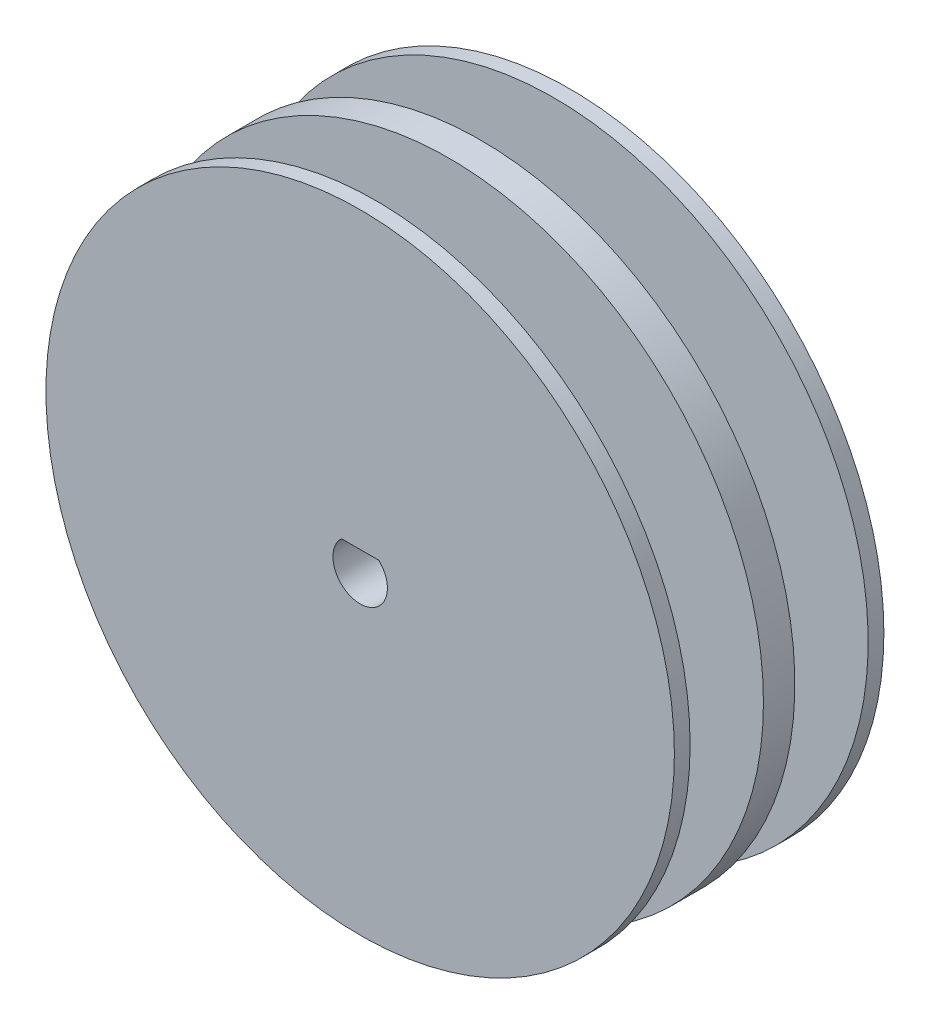
ISO-10303-21;
HEADER;
FILE_DESCRIPTION(('STEP AP214'),'2;1');
FILE_NAME('part.step','',(''),(''),'','','');
FILE_SCHEMA(('AUTOMOTIVE_DESIGN { 1 0 10303 214 1 1 1 1 }'));
ENDSEC;
DATA;
#1=APPLICATION_CONTEXT('core data for automotive mechanical design processes');
#2=APPLICATION_PROTOCOL_DEFINITION('international standard','automotive_design',2000,#1);
#3=PRODUCT_CONTEXT('',#1,'mechanical');
#4=PRODUCT('Part','Part','',(#3));
#5=PRODUCT_RELATED_PRODUCT_CATEGORY('part','',(#4));
#6=PRODUCT_DEFINITION_FORMATION('','',#4);
#7=PRODUCT_DEFINITION_CONTEXT('part definition',#1,'design');
#8=PRODUCT_DEFINITION('design','',#6,#7);
#9=PRODUCT_DEFINITION_SHAPE('','',#8);
#10=(LENGTH_UNIT() NAMED_UNIT(*) SI_UNIT(.MILLI.,.METRE.));
#11=(NAMED_UNIT(*) PLANE_ANGLE_UNIT() SI_UNIT($,.RADIAN.));
#12=(NAMED_UNIT(*) SI_UNIT($,.STERADIAN.) SOLID_ANGLE_UNIT());
#13=UNCERTAINTY_MEASURE_WITH_UNIT(LENGTH_MEASURE(1.E-05),#10,'distance_accuracy_value','');
#14=(GEOMETRIC_REPRESENTATION_CONTEXT(3) GLOBAL_UNCERTAINTY_ASSIGNED_CONTEXT((#13)) GLOBAL_UNIT_ASSIGNED_CONTEXT((#10,
#11,#12)) REPRESENTATION_CONTEXT('',''));
#15=CARTESIAN_POINT('',(0.,0.,0.));
#16=DIRECTION('',(0.,0.,1.));
#17=DIRECTION('',(1.,0.,0.));
#18=AXIS2_PLACEMENT_3D('',#15,#16,#17);
#19=CARTESIAN_POINT('',(0.,0.,10.));
#20=DIRECTION('',(0.,0.,-1.));
#21=DIRECTION('',(-1.,0.,0.));
#22=AXIS2_PLACEMENT_3D('',#19,#20,#21);
#23=CYLINDRICAL_SURFACE('',#22,30.);
#24=CARTESIAN_POINT('',(0.,0.,1.5));
#25=DIRECTION('',(0.,0.,1.));
#26=DIRECTION('',(1.,0.,0.));
#27=AXIS2_PLACEMENT_3D('',#24,#25,#26);
#28=CIRCLE('',#27,30.);
#29=CARTESIAN_POINT('',(30.,0.,1.5));
#30=VERTEX_POINT('',#29);
#31=EDGE_CURVE('E126',#30,#30,#28,.T.);
#32=ORIENTED_EDGE('',*,*,#31,.F.);
#33=EDGE_LOOP('',(#32));
#34=FACE_BOUND('',#33,.T.);
#35=CARTESIAN_POINT('',(0.,0.,-1.5));
#36=DIRECTION('',(0.,0.,-1.));
#37=DIRECTION('',(-1.,0.,0.));
#38=AXIS2_PLACEMENT_3D('',#35,#36,#37);
#39=CIRCLE('',#38,30.);
#40=CARTESIAN_POINT('',(-30.,0.,-1.5));
#41=VERTEX_POINT('',#40);
#42=EDGE_CURVE('E121',#41,#41,#39,.T.);
#43=ORIENTED_EDGE('',*,*,#42,.F.);
#44=EDGE_LOOP('',(#43));
#45=FACE_BOUND('',#44,.T.);
#46=ADVANCED_FACE('F45',(#34,#45),#23,.T.);
#47=CARTESIAN_POINT('',(0.,0.,1.5));
#48=DIRECTION('',(0.,0.,1.));
#49=DIRECTION('',(1.,0.,0.));
#50=AXIS2_PLACEMENT_3D('',#47,#48,#49);
#51=PLANE('',#50);
#52=CARTESIAN_POINT('',(0.,0.,1.5));
#53=DIRECTION('',(0.,0.,1.));
#54=DIRECTION('',(1.,0.,0.));
#55=AXIS2_PLACEMENT_3D('',#52,#53,#54);
#56=CIRCLE('',#55,20.);
#57=CARTESIAN_POINT('',(20.,0.,1.5));
#58=VERTEX_POINT('',#57);
#59=EDGE_CURVE('E113',#58,#58,#56,.T.);
#60=ORIENTED_EDGE('',*,*,#59,.F.);
#61=EDGE_LOOP('',(#60));
#62=FACE_BOUND('',#61,.T.);
#63=ORIENTED_EDGE('',*,*,#31,.T.);
#64=EDGE_LOOP('',(#63));
#65=FACE_BOUND('',#64,.T.);
#66=ADVANCED_FACE('F182',(#62,#65),#51,.T.);
#67=CARTESIAN_POINT('',(0.,0.,8.5));
#68=DIRECTION('',(0.,0.,1.));
#69=DIRECTION('',(1.,0.,0.));
#70=AXIS2_PLACEMENT_3D('',#67,#68,#69);
#71=PLANE('',#70);
#72=CARTESIAN_POINT('',(0.,0.,8.5));
#73=DIRECTION('',(0.,0.,1.));
#74=DIRECTION('',(1.,0.,0.));
#75=AXIS2_PLACEMENT_3D('',#72,#73,#74);
#76=CIRCLE('',#75,20.);
#77=CARTESIAN_POINT('',(20.,0.,8.5));
#78=VERTEX_POINT('',#77);
#79=EDGE_CURVE('E118',#78,#78,#76,.T.);
#80=ORIENTED_EDGE('',*,*,#79,.T.);
#81=EDGE_LOOP('',(#80));
#82=FACE_BOUND('',#81,.T.);
#83=CARTESIAN_POINT('',(0.,0.,8.5));
#84=DIRECTION('',(0.,0.,1.));
#85=DIRECTION('',(1.,0.,0.));
#86=AXIS2_PLACEMENT_3D('',#83,#84,#85);
#87=CIRCLE('',#86,30.);
#88=CARTESIAN_POINT('',(30.,0.,8.5));
#89=VERTEX_POINT('',#88);
#90=EDGE_CURVE('E117',#89,#89,#87,.T.);
#91=ORIENTED_EDGE('',*,*,#90,.F.);
#92=EDGE_LOOP('',(#91));
#93=FACE_BOUND('',#92,.T.);
#94=ADVANCED_FACE('F179',(#82,#93),#71,.F.);
#95=CARTESIAN_POINT('',(0.,0.,1.5));
#96=DIRECTION('',(0.,0.,1.));
#97=DIRECTION('',(1.,0.,0.));
#98=AXIS2_PLACEMENT_3D('',#95,#96,#97);
#99=CYLINDRICAL_SURFACE('',#98,20.);
#100=CARTESIAN_POINT('',(-17.3205080756888,10.,3.4));
#101=CARTESIAN_POINT('',(-17.3769766190869,9.90219235846516,3.4000016966526));
#102=CARTESIAN_POINT('',(-17.4326272848444,9.80387339229667,3.40897204604197));
#103=CARTESIAN_POINT('',(-17.5408583738365,9.60888789723807,3.44537210866661));
#104=CARTESIAN_POINT('',(-17.5934378170598,9.51222190268676,3.4728076794652));
#105=CARTESIAN_POINT('',(-17.6943033735048,9.32325849706307,3.54660608765069));
#106=CARTESIAN_POINT('',(-17.7425678937011,9.23098403255311,3.59305826266499));
#107=CARTESIAN_POINT('',(-17.8329796450054,9.05508764312785,3.70463721589814));
#108=CARTESIAN_POINT('',(-17.8751308250085,8.97146014284393,3.76975185750795));
#109=CARTESIAN_POINT('',(-17.9479686305999,8.82476455152446,3.91001382368749));
#110=CARTESIAN_POINT('',(-17.9793803533661,8.76047660064908,3.98350556594368));
#111=CARTESIAN_POINT('',(-18.034978747028,8.64544016950977,4.14279962503263));
#112=CARTESIAN_POINT('',(-18.0591716737047,8.59467997024873,4.22859118686163));
#113=CARTESIAN_POINT('',(-18.0971288170195,8.51443927478675,4.39920664261865));
#114=CARTESIAN_POINT('',(-18.1117741126374,8.48317950319136,4.48300053339963));
#115=CARTESIAN_POINT('',(-18.1342745080825,8.4349752252528,4.6554719067555));
#116=CARTESIAN_POINT('',(-18.1421332318581,8.41802307891838,4.74414675601247));
#117=CARTESIAN_POINT('',(-18.150488756358,8.39999078838395,4.91672496690576));
#118=CARTESIAN_POINT('',(-18.1514899159447,8.39782331749314,5.00049229952282));
#119=CARTESIAN_POINT('',(-18.1474394870168,8.40657266170654,5.16718281436714));
#120=CARTESIAN_POINT('',(-18.1423890497814,8.41748698807886,5.25010615413256));
#121=CARTESIAN_POINT('',(-18.126541336908,8.45155830351023,5.41104834212301));
#122=CARTESIAN_POINT('',(-18.1158617197984,8.47446457824167,5.48913229690164));
#123=CARTESIAN_POINT('',(-18.0891119157629,8.53141334857163,5.64012985653461));
#124=CARTESIAN_POINT('',(-18.0730413223132,8.56545668399108,5.71304307097027));
#125=CARTESIAN_POINT('',(-18.0353362207228,8.64457156867286,5.85414028442218));
#126=CARTESIAN_POINT('',(-18.013545833008,8.68995001601785,5.92210994637072));
#127=CARTESIAN_POINT('',(-17.9651949946128,8.78947241329046,6.04935872271441));
#128=CARTESIAN_POINT('',(-17.9386333144365,8.84361862219336,6.10863558992871));
#129=CARTESIAN_POINT('',(-17.879217473205,8.96316620341432,6.22156636019833));
#130=CARTESIAN_POINT('',(-17.8460438743577,9.02910291630392,6.27448413832978));
#131=CARTESIAN_POINT('',(-17.7756471853747,9.16691659483871,6.36855471919931));
#132=CARTESIAN_POINT('',(-17.7384225230004,9.23879586420114,6.40970293146719));
#133=CARTESIAN_POINT('',(-17.656643970551,9.39422160969361,6.48363954665654));
#134=CARTESIAN_POINT('',(-17.6117304792104,9.47820389873561,6.51511279892113));
#135=CARTESIAN_POINT('',(-17.5189206566401,9.64867119330112,6.56346689051586));
#136=CARTESIAN_POINT('',(-17.4710229535879,9.73515733990541,6.58034096484479));
#137=CARTESIAN_POINT('',(-17.3677824921372,9.91828393906461,6.60085237382204));
#138=CARTESIAN_POINT('',(-17.3122048854429,10.0149819462889,6.60280508523789));
#139=CARTESIAN_POINT('',(-17.1999565412864,10.2065588870567,6.58951690160654));
#140=CARTESIAN_POINT('',(-17.1432853174468,10.301436971972,6.57426817467138));
#141=CARTESIAN_POINT('',(-17.0259091270636,10.4943851883152,6.52520308678683));
#142=CARTESIAN_POINT('',(-16.9652317135677,10.5921333592632,6.49004005033899));
#143=CARTESIAN_POINT('',(-16.8462889573658,10.7803037957049,6.40070661129347));
#144=CARTESIAN_POINT('',(-16.7880253873267,10.8707207223696,6.3465225073359));
#145=CARTESIAN_POINT('',(-16.6772844825084,11.0398483587406,6.22052404401057));
#146=CARTESIAN_POINT('',(-16.6247348910597,11.1187111434674,6.14897956401571));
#147=CARTESIAN_POINT('',(-16.5276166311059,11.2625664921824,5.98866332007091));
#148=CARTESIAN_POINT('',(-16.4830281862977,11.3275935049783,5.89993541885461));
#149=CARTESIAN_POINT('',(-16.4177566305308,11.4218854641986,5.737618410711));
#150=CARTESIAN_POINT('',(-16.3939661863812,11.4559649476479,5.66805053045791));
#151=CARTESIAN_POINT('',(-16.3531699143275,11.5141259794297,5.52298259749087));
#152=CARTESIAN_POINT('',(-16.3361583911687,11.5382159210878,5.44748758851591));
#153=CARTESIAN_POINT('',(-16.3100012358771,11.57516249368,5.29202237694242));
#154=CARTESIAN_POINT('',(-16.3008969213778,11.5879601242469,5.2120309653668));
#155=CARTESIAN_POINT('',(-16.2914408366719,11.6012511487044,5.05051705110107));
#156=CARTESIAN_POINT('',(-16.2910865203575,11.6017481218871,4.96899500071209));
#157=CARTESIAN_POINT('',(-16.2987980258291,11.5909107932495,4.81426534432348));
#158=CARTESIAN_POINT('',(-16.3061411314292,11.5805919984181,4.74094645750472));
#159=CARTESIAN_POINT('',(-16.3276424840637,11.5502568176366,4.5973997875877));
#160=CARTESIAN_POINT('',(-16.3418012925835,11.5302396327209,4.52717225967949));
#161=CARTESIAN_POINT('',(-16.3765108620771,11.4808891949603,4.38972732871149));
#162=CARTESIAN_POINT('',(-16.3972100562322,11.4513392322559,4.32262620074823));
#163=CARTESIAN_POINT('',(-16.4438041831117,11.3843298783951,4.19447774774088));
#164=CARTESIAN_POINT('',(-16.4697010285477,11.3468675752678,4.13343266368665));
#165=CARTESIAN_POINT('',(-16.5294105688785,11.2597393390578,4.01030999316515));
#166=CARTESIAN_POINT('',(-16.563820028705,11.2091084507576,3.9492071641663));
#167=CARTESIAN_POINT('',(-16.6365737804865,11.1008411440538,3.83626514783468));
#168=CARTESIAN_POINT('',(-16.6749206809459,11.0432000767719,3.78443216480398));
#169=CARTESIAN_POINT('',(-16.761356064532,10.911652556702,3.68204619097304));
#170=CARTESIAN_POINT('',(-16.8099717370776,10.8366683456517,3.63332143261198));
#171=CARTESIAN_POINT('',(-16.909404777433,10.6808512018872,3.54938652950841));
#172=CARTESIAN_POINT('',(-16.9602228198598,10.6000164719232,3.51418055879122));
#173=CARTESIAN_POINT('',(-17.0628642145867,10.4339928623789,3.45748248399133));
#174=CARTESIAN_POINT('',(-17.1146896888631,10.3487939883165,3.43602353143947));
#175=CARTESIAN_POINT('',(-17.2180675642196,10.1758687227434,3.40728056297726));
#176=CARTESIAN_POINT('',(-17.269619927289,10.088141989815,3.39999847101583));
#177=CARTESIAN_POINT('',(-17.3205080756888,10.,3.4));
#178=B_SPLINE_CURVE_WITH_KNOTS('',3,(#100,#101,#102,#103,#104,#105,#106,#107,#108,#109,#110,
#111,#112,#113,#114,#115,#116,#117,#118,#119,#120,#121,#122,#123,#124,#125,#126,#127,#128,#129,
#130,#131,#132,#133,#134,#135,#136,#137,#138,#139,#140,#141,#142,#143,#144,#145,#146,#147,#148,
#149,#150,#151,#152,#153,#154,#155,#156,#157,#158,#159,#160,#161,#162,#163,#164,#165,#166,#167,
#168,#169,#170,#171,#172,#173,#174,#175,#176,#177),.UNSPECIFIED.,.T.,.F.,(4,2,2,2,2,2,2,2,2,2,2,
2,2,2,2,2,2,2,2,2,2,2,2,2,2,2,2,2,2,2,2,2,2,2,2,2,2,2,4),(0.,0.338485666090355,
0.677078757716712,1.01728111204614,1.35726272542255,1.66322896229161,1.96892927474097,
2.23936521294675,2.50965665213796,2.75983261808951,3.00996099714757,3.25505731238,
3.50017211404124,3.75282338951824,4.00553986336441,4.27687694607607,4.54831971421605,
4.84800330148707,5.14782568257745,5.48105963421385,5.81444536994369,6.17365351312043,
6.53312093581921,6.88732277797779,7.24063211925975,7.48277114899953,7.72470631654292,
7.96789819355753,8.21101930484017,8.43319695865494,8.65539291885439,8.88304551770324,
9.11078204576254,9.36928656026479,9.62796344939774,9.93213268595367,10.2363957616332,
10.5413898459463,10.8464253182761),.UNSPECIFIED.);
#179=CARTESIAN_POINT('',(-17.3205080756888,10.,3.4));
#180=VERTEX_POINT('',#179);
#181=EDGE_CURVE('E49',#180,#180,#178,.T.);
#182=ORIENTED_EDGE('',*,*,#181,.F.);
#183=EDGE_LOOP('',(#182));
#184=FACE_BOUND('',#183,.T.);
#185=CARTESIAN_POINT('',(17.3205080756888,10.,3.4));
#186=CARTESIAN_POINT('',(17.2523224707943,10.1180955330894,3.4000035554067));
#187=CARTESIAN_POINT('',(17.1828365987541,10.2356268298851,3.41309012173077));
#188=CARTESIAN_POINT('',(17.0439141636452,10.4653280405904,3.46462506722424));
#189=CARTESIAN_POINT('',(16.9744780931463,10.5774848173184,3.50313249874543));
#190=CARTESIAN_POINT('',(16.8466740848817,10.7797124449772,3.5989019561987));
#191=CARTESIAN_POINT('',(16.7879559393252,10.8708365772978,3.65347379281427));
#192=CARTESIAN_POINT('',(16.6756710894061,11.0423025467071,3.78139485428039));
#193=CARTESIAN_POINT('',(16.6220924279288,11.1226695917065,3.85469896537807));
#194=CARTESIAN_POINT('',(16.5361255393502,11.2499270301863,3.99783819786713));
#195=CARTESIAN_POINT('',(16.5018461209071,11.3000930188665,4.06363863744932));
#196=CARTESIAN_POINT('',(16.4394668738192,11.3906517505835,4.20434155945221));
#197=CARTESIAN_POINT('',(16.4113642041867,11.4310489876056,4.27923983261937));
#198=CARTESIAN_POINT('',(16.3629050534636,11.500311089712,4.43735513718272));
#199=CARTESIAN_POINT('',(16.3426114121023,11.5290824899114,4.52063311734705));
#200=CARTESIAN_POINT('',(16.3117819654951,11.5726618835283,4.69248576660295));
#201=CARTESIAN_POINT('',(16.3012360947872,11.5874842808505,4.78105487125642));
#202=CARTESIAN_POINT('',(16.291592105589,11.6010377553989,4.94789011640418));
#203=CARTESIAN_POINT('',(16.291138090166,11.6016747460921,5.02592878309861));
#204=CARTESIAN_POINT('',(16.298283218191,11.5916350406122,5.18088661427931));
#205=CARTESIAN_POINT('',(16.305880601055,11.5809608178405,5.25780601978456));
#206=CARTESIAN_POINT('',(16.3279837505808,11.5497741378161,5.40439696925507));
#207=CARTESIAN_POINT('',(16.3421212352858,11.5297857807703,5.47423836424914));
#208=CARTESIAN_POINT('',(16.3763015419037,11.4811857540439,5.60929770724452));
#209=CARTESIAN_POINT('',(16.3963456580325,11.4525721944432,5.6745146380792));
#210=CARTESIAN_POINT('',(16.4433340466129,11.3850162859058,5.80471817684075));
#211=CARTESIAN_POINT('',(16.4707289844808,11.3453886686726,5.86918406181839));
#212=CARTESIAN_POINT('',(16.5300953619738,11.2587169861794,5.9905561744714));
#213=CARTESIAN_POINT('',(16.5620691930959,11.2116690440699,6.04745842162237));
#214=CARTESIAN_POINT('',(16.6350205090387,11.1031988748158,6.16196000314061));
#215=CARTESIAN_POINT('',(16.6766137050941,11.0406853309839,6.21813220265437));
#216=CARTESIAN_POINT('',(16.7629741161702,10.909120280005,6.31924007799576));
#217=CARTESIAN_POINT('',(16.8077432891264,10.8400647308702,6.36416874374351));
#218=CARTESIAN_POINT('',(16.9068875505437,10.6848943390198,6.4491363617712));
#219=CARTESIAN_POINT('',(16.9616149550944,10.5978602027171,6.4870934670548));
#220=CARTESIAN_POINT('',(17.0720537606219,10.4190233381621,6.54703703005545));
#221=CARTESIAN_POINT('',(17.1277657081253,10.3272179027105,6.56901431256338));
#222=CARTESIAN_POINT('',(17.2441291356527,10.1318375529286,6.59790062666685));
#223=CARTESIAN_POINT('',(17.3047362408852,10.0279840926134,6.60314350993745));
#224=CARTESIAN_POINT('',(17.4236692750967,9.81988355904184,6.5932381551504));
#225=CARTESIAN_POINT('',(17.481994866315,9.71563642999203,6.57808690956658));
#226=CARTESIAN_POINT('',(17.5938869925408,9.51149321515576,6.5271785465846));
#227=CARTESIAN_POINT('',(17.647507242423,9.41155734237508,6.49170301331042));
#228=CARTESIAN_POINT('',(17.7491523990086,9.21843155314138,6.40019421919925));
#229=CARTESIAN_POINT('',(17.7971809694524,9.1252372348681,6.34417452017489));
#230=CARTESIAN_POINT('',(17.8814943946199,8.95879475706173,6.21886764347763));
#231=CARTESIAN_POINT('',(17.9184729804704,8.88448414349006,6.15146336687535));
#232=CARTESIAN_POINT('',(17.9852630645244,8.74848889088797,6.00194866873111));
#233=CARTESIAN_POINT('',(18.0150813217119,8.68679235305588,5.91985224462987));
#234=CARTESIAN_POINT('',(18.0633078609583,8.58601521083009,5.75423753997611));
#235=CARTESIAN_POINT('',(18.0826639514833,8.54509447374041,5.67211260901172));
#236=CARTESIAN_POINT('',(18.1143825262328,8.47764990900356,5.50089592096435));
#237=CARTESIAN_POINT('',(18.1267495500009,8.45111673678969,5.41180872892193));
#238=CARTESIAN_POINT('',(18.1433007838419,8.41552052047573,5.23788777348449));
#239=CARTESIAN_POINT('',(18.1481192215122,8.40510445806756,5.1533887609707));
#240=CARTESIAN_POINT('',(18.1514853226309,8.39783308180605,4.98369380466774));
#241=CARTESIAN_POINT('',(18.1500347789447,8.40097389082372,4.89849806709099));
#242=CARTESIAN_POINT('',(18.1410758204239,8.42030109467187,4.73310473988161));
#243=CARTESIAN_POINT('',(18.1337901782501,8.43600772734724,4.65283816612395));
#244=CARTESIAN_POINT('',(18.1136384919997,8.47919001940217,4.49628284226197));
#245=CARTESIAN_POINT('',(18.1007723901686,8.50666580058528,4.41999413333529));
#246=CARTESIAN_POINT('',(18.0695396355021,8.57281100800094,4.2721274249391));
#247=CARTESIAN_POINT('',(18.0510872818781,8.61165449657887,4.2006457155888));
#248=CARTESIAN_POINT('',(18.0092240651475,8.69886096551942,4.06537824015675));
#249=CARTESIAN_POINT('',(17.9858123657665,8.74722555128903,4.00159377488128));
#250=CARTESIAN_POINT('',(17.9329835821167,8.85505013647341,3.87922197946939));
#251=CARTESIAN_POINT('',(17.9032850193295,8.91501072276271,3.82119843517067));
#252=CARTESIAN_POINT('',(17.8395927747325,9.04178985527977,3.71601125081573));
#253=CARTESIAN_POINT('',(17.8055966315637,9.10861232737548,3.6688538781956));
#254=CARTESIAN_POINT('',(17.7305526767636,9.25390786721381,3.58183322263356));
#255=CARTESIAN_POINT('',(17.6891406536938,9.33288210683119,3.54312369699649));
#256=CARTESIAN_POINT('',(17.602981163363,9.49438900873736,3.47951052685096));
#257=CARTESIAN_POINT('',(17.5582355963363,9.57691963262293,3.45459908425109));
#258=CARTESIAN_POINT('',(17.4812516826091,9.71648000784323,3.42426683866923));
#259=CARTESIAN_POINT('',(17.4496645366345,9.77309756542111,3.41514489179119));
#260=CARTESIAN_POINT('',(17.3856542631046,9.88652003327693,3.40300975961787));
#261=CARTESIAN_POINT('',(17.3532309028481,9.94332499178449,3.39999829373137));
#262=CARTESIAN_POINT('',(17.3205080756888,10.,3.4));
#263=B_SPLINE_CURVE_WITH_KNOTS('',3,(#185,#186,#187,#188,#189,#190,#191,#192,#193,#194,#195,
#196,#197,#198,#199,#200,#201,#202,#203,#204,#205,#206,#207,#208,#209,#210,#211,#212,#213,#214,
#215,#216,#217,#218,#219,#220,#221,#222,#223,#224,#225,#226,#227,#228,#229,#230,#231,#232,#233,
#234,#235,#236,#237,#238,#239,#240,#241,#242,#243,#244,#245,#246,#247,#248,#249,#250,#251,#252,
#253,#254,#255,#256,#257,#258,#259,#260,#261,#262),.UNSPECIFIED.,.T.,.F.,(4,2,2,2,2,2,2,2,2,2,2,
2,2,2,2,2,2,2,2,2,2,2,2,2,2,2,2,2,2,2,2,2,2,2,2,2,2,2,4),(0.,0.408801618436068,
0.818556235407694,1.18083111638902,1.54224160517922,1.80988104722546,2.07739713004396,
2.34702302794133,2.61637020047073,2.84927251555888,3.08212391284836,3.30321530289064,
3.52435517285222,3.76486855702986,4.00550801951351,4.28575958908062,4.56618545603819,
4.89361485301767,5.22123210351562,5.58058998526173,5.94000086739135,6.294548696633,
6.64886289840568,6.96780425088705,7.28644334503511,7.56623878120647,7.84585227496023,
8.10039684243838,8.35486861755219,8.60006340762482,8.84526073537602,9.09442873775521,
9.34363878982652,9.60823086360245,9.8729751700109,10.1634403418916,10.4537411872371,
10.6498732322847,10.8460604586536),.UNSPECIFIED.);
#264=CARTESIAN_POINT('',(17.3205080756888,10.,3.4));
#265=VERTEX_POINT('',#264);
#266=EDGE_CURVE('E167',#265,#265,#263,.T.);
#267=ORIENTED_EDGE('',*,*,#266,.F.);
#268=EDGE_LOOP('',(#267));
#269=FACE_BOUND('',#268,.T.);
#270=ORIENTED_EDGE('',*,*,#59,.T.);
#271=EDGE_LOOP('',(#270));
#272=FACE_BOUND('',#271,.T.);
#273=ORIENTED_EDGE('',*,*,#79,.F.);
#274=EDGE_LOOP('',(#273));
#275=FACE_BOUND('',#274,.T.);
#276=ADVANCED_FACE('F173',(#184,#269,#272,#275),#99,.T.);
#277=CARTESIAN_POINT('',(0.,0.,10.));
#278=DIRECTION('',(0.,0.,1.));
#279=DIRECTION('',(1.,0.,0.));
#280=AXIS2_PLACEMENT_3D('',#277,#278,#279);
#281=PLANE('',#280);
#282=CARTESIAN_POINT('',(0.,0.,10.));
#283=DIRECTION('',(0.,0.,-1.));
#284=DIRECTION('',(-1.,0.,0.));
#285=AXIS2_PLACEMENT_3D('',#282,#283,#284);
#286=CIRCLE('',#285,2.6);
#287=CARTESIAN_POINT('',(1.77482393492988,1.9,10.));
#288=VERTEX_POINT('',#287);
#289=CARTESIAN_POINT('',(-1.77482393492988,1.9,10.));
#290=VERTEX_POINT('',#289);
#291=EDGE_CURVE('E68',#288,#290,#286,.T.);
#292=ORIENTED_EDGE('',*,*,#291,.T.);
#293=DIRECTION('',(1.,0.,0.));
#294=VECTOR('',#293,1.);
#295=CARTESIAN_POINT('',(1.77482393492988,1.9,10.));
#296=LINE('',#295,#294);
#297=EDGE_CURVE('E99',#290,#288,#296,.T.);
#298=ORIENTED_EDGE('',*,*,#297,.T.);
#299=EDGE_LOOP('',(#292,#298));
#300=FACE_BOUND('',#299,.T.);
#301=CARTESIAN_POINT('',(0.,0.,10.));
#302=DIRECTION('',(0.,0.,1.));
#303=DIRECTION('',(1.,0.,0.));
#304=AXIS2_PLACEMENT_3D('',#301,#302,#303);
#305=CIRCLE('',#304,30.);
#306=CARTESIAN_POINT('',(30.,0.,10.));
#307=VERTEX_POINT('',#306);
#308=EDGE_CURVE('E12',#307,#307,#305,.T.);
#309=ORIENTED_EDGE('',*,*,#308,.T.);
#310=EDGE_LOOP('',(#309));
#311=FACE_BOUND('',#310,.T.);
#312=ADVANCED_FACE('F178',(#300,#311),#281,.T.);
#313=ORIENTED_EDGE('',*,*,#90,.T.);
#314=EDGE_LOOP('',(#313));
#315=FACE_BOUND('',#314,.T.);
#316=ORIENTED_EDGE('',*,*,#308,.F.);
#317=EDGE_LOOP('',(#316));
#318=FACE_BOUND('',#317,.T.);
#319=ADVANCED_FACE('F47',(#315,#318),#23,.T.);
#320=CARTESIAN_POINT('',(0.,0.,-1.5));
#321=DIRECTION('',(0.,0.,-1.));
#322=DIRECTION('',(-1.,0.,0.));
#323=AXIS2_PLACEMENT_3D('',#320,#321,#322);
#324=PLANE('',#323);
#325=CARTESIAN_POINT('',(0.,0.,-1.5));
#326=DIRECTION('',(0.,0.,1.));
#327=DIRECTION('',(1.,0.,0.));
#328=AXIS2_PLACEMENT_3D('',#325,#326,#327);
#329=CIRCLE('',#328,20.);
#330=CARTESIAN_POINT('',(20.,0.,-1.5));
#331=VERTEX_POINT('',#330);
#332=EDGE_CURVE('E104',#331,#331,#329,.T.);
#333=ORIENTED_EDGE('',*,*,#332,.T.);
#334=EDGE_LOOP('',(#333));
#335=FACE_BOUND('',#334,.T.);
#336=ORIENTED_EDGE('',*,*,#42,.T.);
#337=EDGE_LOOP('',(#336));
#338=FACE_BOUND('',#337,.T.);
#339=ADVANCED_FACE('F206',(#335,#338),#324,.T.);
#340=CARTESIAN_POINT('',(0.,0.,-8.5));
#341=DIRECTION('',(0.,0.,-1.));
#342=DIRECTION('',(-1.,0.,0.));
#343=AXIS2_PLACEMENT_3D('',#340,#341,#342);
#344=PLANE('',#343);
#345=CARTESIAN_POINT('',(0.,0.,-8.5));
#346=DIRECTION('',(0.,0.,1.));
#347=DIRECTION('',(1.,0.,0.));
#348=AXIS2_PLACEMENT_3D('',#345,#346,#347);
#349=CIRCLE('',#348,20.);
#350=CARTESIAN_POINT('',(20.,0.,-8.5));
#351=VERTEX_POINT('',#350);
#352=EDGE_CURVE('E109',#351,#351,#349,.T.);
#353=ORIENTED_EDGE('',*,*,#352,.F.);
#354=EDGE_LOOP('',(#353));
#355=FACE_BOUND('',#354,.T.);
#356=CARTESIAN_POINT('',(0.,0.,-8.5));
#357=DIRECTION('',(0.,0.,-1.));
#358=DIRECTION('',(-1.,0.,0.));
#359=AXIS2_PLACEMENT_3D('',#356,#357,#358);
#360=CIRCLE('',#359,30.);
#361=CARTESIAN_POINT('',(-30.,0.,-8.5));
#362=VERTEX_POINT('',#361);
#363=EDGE_CURVE('E108',#362,#362,#360,.T.);
#364=ORIENTED_EDGE('',*,*,#363,.F.);
#365=EDGE_LOOP('',(#364));
#366=FACE_BOUND('',#365,.T.);
#367=ADVANCED_FACE('F181',(#355,#366),#344,.F.);
#368=CARTESIAN_POINT('',(0.,0.,-1.5));
#369=DIRECTION('',(0.,0.,-1.));
#370=DIRECTION('',(-1.,0.,0.));
#371=AXIS2_PLACEMENT_3D('',#368,#369,#370);
#372=CYLINDRICAL_SURFACE('',#371,20.);
#373=CARTESIAN_POINT('',(-17.3205080756888,10.,-6.6));
#374=CARTESIAN_POINT('',(-17.2523224707943,10.1180955330894,-6.5999964445933));
#375=CARTESIAN_POINT('',(-17.1828365987541,10.2356268298851,-6.58690987826923));
#376=CARTESIAN_POINT('',(-17.0439141636452,10.4653280405904,-6.53537493277576));
#377=CARTESIAN_POINT('',(-16.9744780931463,10.5774848173184,-6.49686750125457));
#378=CARTESIAN_POINT('',(-16.8466740848817,10.7797124449772,-6.4010980438013));
#379=CARTESIAN_POINT('',(-16.7879559393252,10.8708365772978,-6.34652620718573));
#380=CARTESIAN_POINT('',(-16.6756710894061,11.0423025467071,-6.21860514571961));
#381=CARTESIAN_POINT('',(-16.6220924279288,11.1226695917065,-6.14530103462193));
#382=CARTESIAN_POINT('',(-16.5361255393502,11.2499270301863,-6.00216180213287));
#383=CARTESIAN_POINT('',(-16.5018461209071,11.3000930188665,-5.93636136255068));
#384=CARTESIAN_POINT('',(-16.4394668738192,11.3906517505835,-5.79565844054779));
#385=CARTESIAN_POINT('',(-16.4113642041867,11.4310489876056,-5.72076016738063));
#386=CARTESIAN_POINT('',(-16.3629050534636,11.500311089712,-5.56264486281728));
#387=CARTESIAN_POINT('',(-16.3426114121023,11.5290824899114,-5.47936688265295));
#388=CARTESIAN_POINT('',(-16.3117819654951,11.5726618835283,-5.30751423339705));
#389=CARTESIAN_POINT('',(-16.3012360947872,11.5874842808505,-5.21894512874358));
#390=CARTESIAN_POINT('',(-16.291592105589,11.6010377553989,-5.05210988359582));
#391=CARTESIAN_POINT('',(-16.291138090166,11.6016747460921,-4.97407121690139));
#392=CARTESIAN_POINT('',(-16.298283218191,11.5916350406122,-4.81911338572069));
#393=CARTESIAN_POINT('',(-16.305880601055,11.5809608178405,-4.74219398021544));
#394=CARTESIAN_POINT('',(-16.3279837505808,11.5497741378161,-4.59560303074493));
#395=CARTESIAN_POINT('',(-16.3421212352858,11.5297857807703,-4.52576163575086));
#396=CARTESIAN_POINT('',(-16.3763015419037,11.4811857540438,-4.39070229275548));
#397=CARTESIAN_POINT('',(-16.3963456580325,11.4525721944432,-4.32548536192081));
#398=CARTESIAN_POINT('',(-16.4433340466129,11.3850162859058,-4.19528182315925));
#399=CARTESIAN_POINT('',(-16.4707289844808,11.3453886686726,-4.13081593818161));
#400=CARTESIAN_POINT('',(-16.5300953619738,11.2587169861794,-4.0094438255286));
#401=CARTESIAN_POINT('',(-16.5620691930959,11.2116690440699,-3.95254157837763));
#402=CARTESIAN_POINT('',(-16.6350205090387,11.1031988748158,-3.83803999685939));
#403=CARTESIAN_POINT('',(-16.6766137050941,11.0406853309839,-3.78186779734563));
#404=CARTESIAN_POINT('',(-16.7629741161702,10.909120280005,-3.68075992200425));
#405=CARTESIAN_POINT('',(-16.8077432891264,10.8400647308702,-3.63583125625649));
#406=CARTESIAN_POINT('',(-16.9068875505437,10.6848943390198,-3.5508636382288));
#407=CARTESIAN_POINT('',(-16.9616149550944,10.5978602027171,-3.5129065329452));
#408=CARTESIAN_POINT('',(-17.0720537606219,10.4190233381621,-3.45296296994455));
#409=CARTESIAN_POINT('',(-17.1277657081253,10.3272179027105,-3.43098568743662));
#410=CARTESIAN_POINT('',(-17.2441291356527,10.1318375529286,-3.40209937333315));
#411=CARTESIAN_POINT('',(-17.3047362408852,10.0279840926134,-3.39685649006255));
#412=CARTESIAN_POINT('',(-17.4236692750967,9.81988355904184,-3.4067618448496));
#413=CARTESIAN_POINT('',(-17.481994866315,9.71563642999203,-3.42191309043342));
#414=CARTESIAN_POINT('',(-17.5938869925408,9.51149321515575,-3.4728214534154));
#415=CARTESIAN_POINT('',(-17.647507242423,9.41155734237508,-3.50829698668958));
#416=CARTESIAN_POINT('',(-17.7491523990086,9.21843155314138,-3.59980578080075));
#417=CARTESIAN_POINT('',(-17.7971809694524,9.1252372348681,-3.65582547982511));
#418=CARTESIAN_POINT('',(-17.8814943946199,8.95879475706173,-3.78113235652237));
#419=CARTESIAN_POINT('',(-17.9184729804704,8.88448414349006,-3.84853663312465));
#420=CARTESIAN_POINT('',(-17.9852630645244,8.74848889088797,-3.99805133126889));
#421=CARTESIAN_POINT('',(-18.0150813217119,8.68679235305587,-4.08014775537013));
#422=CARTESIAN_POINT('',(-18.0633078609583,8.58601521083009,-4.24576246002389));
#423=CARTESIAN_POINT('',(-18.0826639514833,8.54509447374041,-4.32788739098827));
#424=CARTESIAN_POINT('',(-18.1143825262328,8.47764990900356,-4.49910407903565));
#425=CARTESIAN_POINT('',(-18.1267495500009,8.45111673678969,-4.58819127107807));
#426=CARTESIAN_POINT('',(-18.1433007838419,8.41552052047573,-4.76211222651551));
#427=CARTESIAN_POINT('',(-18.1481192215122,8.40510445806756,-4.8466112390293));
#428=CARTESIAN_POINT('',(-18.1514853226309,8.39783308180605,-5.01630619533226));
#429=CARTESIAN_POINT('',(-18.1500347789447,8.40097389082372,-5.10150193290901));
#430=CARTESIAN_POINT('',(-18.1410758204239,8.42030109467187,-5.26689526011839));
#431=CARTESIAN_POINT('',(-18.1337901782501,8.43600772734724,-5.34716183387605));
#432=CARTESIAN_POINT('',(-18.1136384919997,8.47919001940217,-5.50371715773803));
#433=CARTESIAN_POINT('',(-18.1007723901686,8.50666580058527,-5.58000586666471));
#434=CARTESIAN_POINT('',(-18.0695396355021,8.57281100800093,-5.7278725750609));
#435=CARTESIAN_POINT('',(-18.0510872818781,8.61165449657887,-5.7993542844112));
#436=CARTESIAN_POINT('',(-18.0092240651475,8.69886096551942,-5.93462175984325));
#437=CARTESIAN_POINT('',(-17.9858123657665,8.74722555128903,-5.99840622511872));
#438=CARTESIAN_POINT('',(-17.9329835821167,8.85505013647341,-6.12077802053062));
#439=CARTESIAN_POINT('',(-17.9032850193295,8.91501072276271,-6.17880156482933));
#440=CARTESIAN_POINT('',(-17.8395927747325,9.04178985527977,-6.28398874918427));
#441=CARTESIAN_POINT('',(-17.8055966315637,9.10861232737548,-6.3311461218044));
#442=CARTESIAN_POINT('',(-17.7305526767636,9.2539078672138,-6.41816677736644));
#443=CARTESIAN_POINT('',(-17.6891406536938,9.33288210683119,-6.45687630300351));
#444=CARTESIAN_POINT('',(-17.602981163363,9.49438900873736,-6.52048947314904));
#445=CARTESIAN_POINT('',(-17.5582355963363,9.57691963262293,-6.54540091574891));
#446=CARTESIAN_POINT('',(-17.4812516826091,9.71648000784323,-6.57573316133077));
#447=CARTESIAN_POINT('',(-17.4496645366345,9.77309756542111,-6.58485510820881));
#448=CARTESIAN_POINT('',(-17.3856542631046,9.88652003327693,-6.59699024038213));
#449=CARTESIAN_POINT('',(-17.3532309028481,9.94332499178449,-6.60000170626863));
#450=CARTESIAN_POINT('',(-17.3205080756888,10.,-6.6));
#451=B_SPLINE_CURVE_WITH_KNOTS('',3,(#373,#374,#375,#376,#377,#378,#379,#380,#381,#382,#383,
#384,#385,#386,#387,#388,#389,#390,#391,#392,#393,#394,#395,#396,#397,#398,#399,#400,#401,#402,
#403,#404,#405,#406,#407,#408,#409,#410,#411,#412,#413,#414,#415,#416,#417,#418,#419,#420,#421,
#422,#423,#424,#425,#426,#427,#428,#429,#430,#431,#432,#433,#434,#435,#436,#437,#438,#439,#440,
#441,#442,#443,#444,#445,#446,#447,#448,#449,#450),.UNSPECIFIED.,.T.,.F.,(4,2,2,2,2,2,2,2,2,2,2,
2,2,2,2,2,2,2,2,2,2,2,2,2,2,2,2,2,2,2,2,2,2,2,2,2,2,2,4),(0.,0.40880161843607,0.818556235407694,
1.18083111638902,1.54224160517922,1.80988104722546,2.07739713004396,2.34702302794133,
2.61637020047072,2.84927251555888,3.08212391284836,3.30321530289065,3.52435517285222,
3.76486855702986,4.00550801951351,4.28575958908061,4.5661854560382,4.89361485301767,
5.22123210351562,5.58058998526173,5.94000086739135,6.29454869663301,6.64886289840568,
6.96780425088706,7.2864433450351,7.56623878120647,7.84585227496023,8.10039684243838,
8.35486861755219,8.60006340762482,8.84526073537602,9.09442873775521,9.34363878982652,
9.60823086360245,9.8729751700109,10.1634403418916,10.4537411872371,10.6498732322847,
10.8460604586536),.UNSPECIFIED.);
#452=CARTESIAN_POINT('',(-17.3205080756888,10.,-6.6));
#453=VERTEX_POINT('',#452);
#454=EDGE_CURVE('E147',#453,#453,#451,.T.);
#455=ORIENTED_EDGE('',*,*,#454,.T.);
#456=EDGE_LOOP('',(#455));
#457=FACE_BOUND('',#456,.T.);
#458=CARTESIAN_POINT('',(17.3205080756888,10.,-6.6));
#459=CARTESIAN_POINT('',(17.3769766190869,9.90219235846516,-6.5999983033474));
#460=CARTESIAN_POINT('',(17.4326272848444,9.80387339229667,-6.59102795395803));
#461=CARTESIAN_POINT('',(17.5408583738365,9.60888789723807,-6.55462789133339));
#462=CARTESIAN_POINT('',(17.5934378170598,9.51222190268676,-6.5271923205348));
#463=CARTESIAN_POINT('',(17.6943033735048,9.32325849706307,-6.45339391234931));
#464=CARTESIAN_POINT('',(17.7425678937011,9.23098403255311,-6.40694173733501));
#465=CARTESIAN_POINT('',(17.8329796450054,9.05508764312785,-6.29536278410186));
#466=CARTESIAN_POINT('',(17.8751308250085,8.97146014284393,-6.23024814249205));
#467=CARTESIAN_POINT('',(17.9479686305999,8.82476455152446,-6.08998617631251));
#468=CARTESIAN_POINT('',(17.9793803533661,8.76047660064907,-6.01649443405632));
#469=CARTESIAN_POINT('',(18.034978747028,8.64544016950977,-5.85720037496737));
#470=CARTESIAN_POINT('',(18.0591716737047,8.59467997024873,-5.77140881313837));
#471=CARTESIAN_POINT('',(18.0971288170195,8.51443927478675,-5.60079335738135));
#472=CARTESIAN_POINT('',(18.1117741126374,8.48317950319136,-5.51699946660037));
#473=CARTESIAN_POINT('',(18.1342745080825,8.4349752252528,-5.3445280932445));
#474=CARTESIAN_POINT('',(18.1421332318581,8.41802307891837,-5.25585324398753));
#475=CARTESIAN_POINT('',(18.150488756358,8.39999078838395,-5.08327503309423));
#476=CARTESIAN_POINT('',(18.1514899159447,8.39782331749314,-4.99950770047718));
#477=CARTESIAN_POINT('',(18.1474394870168,8.40657266170654,-4.83281718563286));
#478=CARTESIAN_POINT('',(18.1423890497814,8.41748698807886,-4.74989384586744));
#479=CARTESIAN_POINT('',(18.126541336908,8.45155830351022,-4.58895165787699));
#480=CARTESIAN_POINT('',(18.1158617197984,8.47446457824167,-4.51086770309836));
#481=CARTESIAN_POINT('',(18.0891119157629,8.53141334857163,-4.35987014346538));
#482=CARTESIAN_POINT('',(18.0730413223132,8.56545668399107,-4.28695692902973));
#483=CARTESIAN_POINT('',(18.0353362207228,8.64457156867286,-4.14585971557782));
#484=CARTESIAN_POINT('',(18.013545833008,8.68995001601785,-4.07789005362928));
#485=CARTESIAN_POINT('',(17.9651949946128,8.78947241329046,-3.95064127728559));
#486=CARTESIAN_POINT('',(17.9386333144365,8.84361862219336,-3.89136441007129));
#487=CARTESIAN_POINT('',(17.879217473205,8.96316620341432,-3.77843363980167));
#488=CARTESIAN_POINT('',(17.8460438743577,9.02910291630392,-3.72551586167022));
#489=CARTESIAN_POINT('',(17.7756471853747,9.16691659483871,-3.6314452808007));
#490=CARTESIAN_POINT('',(17.7384225230004,9.23879586420114,-3.59029706853282));
#491=CARTESIAN_POINT('',(17.656643970551,9.39422160969361,-3.51636045334346));
#492=CARTESIAN_POINT('',(17.6117304792104,9.47820389873561,-3.48488720107887));
#493=CARTESIAN_POINT('',(17.5189206566401,9.64867119330112,-3.43653310948414));
#494=CARTESIAN_POINT('',(17.4710229535879,9.73515733990541,-3.41965903515521));
#495=CARTESIAN_POINT('',(17.3677824921372,9.91828393906461,-3.39914762617796));
#496=CARTESIAN_POINT('',(17.3122048854429,10.0149819462889,-3.39719491476211));
#497=CARTESIAN_POINT('',(17.1999565412864,10.2065588870567,-3.41048309839346));
#498=CARTESIAN_POINT('',(17.1432853174468,10.301436971972,-3.42573182532862));
#499=CARTESIAN_POINT('',(17.0259091270636,10.4943851883152,-3.47479691321317));
#500=CARTESIAN_POINT('',(16.9652317135677,10.5921333592632,-3.50995994966101));
#501=CARTESIAN_POINT('',(16.8462889573658,10.7803037957049,-3.59929338870654));
#502=CARTESIAN_POINT('',(16.7880253873267,10.8707207223696,-3.6534774926641));
#503=CARTESIAN_POINT('',(16.6772844825084,11.0398483587406,-3.77947595598943));
#504=CARTESIAN_POINT('',(16.6247348910597,11.1187111434674,-3.85102043598429));
#505=CARTESIAN_POINT('',(16.5276166311059,11.2625664921824,-4.01133667992909));
#506=CARTESIAN_POINT('',(16.4830281862977,11.3275935049783,-4.10006458114539));
#507=CARTESIAN_POINT('',(16.4177566305308,11.4218854641986,-4.262381589289));
#508=CARTESIAN_POINT('',(16.3939661863812,11.4559649476479,-4.33194946954209));
#509=CARTESIAN_POINT('',(16.3531699143275,11.5141259794297,-4.47701740250913));
#510=CARTESIAN_POINT('',(16.3361583911687,11.5382159210878,-4.55251241148409));
#511=CARTESIAN_POINT('',(16.3100012358771,11.57516249368,-4.70797762305758));
#512=CARTESIAN_POINT('',(16.3008969213778,11.5879601242469,-4.7879690346332));
#513=CARTESIAN_POINT('',(16.2914408366719,11.6012511487044,-4.94948294889893));
#514=CARTESIAN_POINT('',(16.2910865203575,11.6017481218871,-5.03100499928791));
#515=CARTESIAN_POINT('',(16.2987980258291,11.5909107932495,-5.18573465567652));
#516=CARTESIAN_POINT('',(16.3061411314292,11.5805919984181,-5.25905354249528));
#517=CARTESIAN_POINT('',(16.3276424840637,11.5502568176366,-5.4026002124123));
#518=CARTESIAN_POINT('',(16.3418012925836,11.5302396327209,-5.47282774032051));
#519=CARTESIAN_POINT('',(16.3765108620771,11.4808891949603,-5.61027267128851));
#520=CARTESIAN_POINT('',(16.3972100562322,11.4513392322559,-5.67737379925177));
#521=CARTESIAN_POINT('',(16.4438041831117,11.3843298783951,-5.80552225225912));
#522=CARTESIAN_POINT('',(16.4697010285477,11.3468675752678,-5.86656733631335));
#523=CARTESIAN_POINT('',(16.5294105688785,11.2597393390578,-5.98969000683485));
#524=CARTESIAN_POINT('',(16.563820028705,11.2091084507576,-6.05079283583371));
#525=CARTESIAN_POINT('',(16.6365737804865,11.1008411440538,-6.16373485216532));
#526=CARTESIAN_POINT('',(16.6749206809459,11.0432000767719,-6.21556783519602));
#527=CARTESIAN_POINT('',(16.761356064532,10.911652556702,-6.31795380902695));
#528=CARTESIAN_POINT('',(16.8099717370776,10.8366683456517,-6.36667856738802));
#529=CARTESIAN_POINT('',(16.909404777433,10.6808512018872,-6.45061347049159));
#530=CARTESIAN_POINT('',(16.9602228198598,10.6000164719232,-6.48581944120878));
#531=CARTESIAN_POINT('',(17.0628642145867,10.4339928623789,-6.54251751600867));
#532=CARTESIAN_POINT('',(17.1146896888631,10.3487939883165,-6.56397646856053));
#533=CARTESIAN_POINT('',(17.2180675642196,10.1758687227434,-6.59271943702274));
#534=CARTESIAN_POINT('',(17.269619927289,10.088141989815,-6.60000152898417));
#535=CARTESIAN_POINT('',(17.3205080756888,10.,-6.6));
#536=B_SPLINE_CURVE_WITH_KNOTS('',3,(#458,#459,#460,#461,#462,#463,#464,#465,#466,#467,#468,
#469,#470,#471,#472,#473,#474,#475,#476,#477,#478,#479,#480,#481,#482,#483,#484,#485,#486,#487,
#488,#489,#490,#491,#492,#493,#494,#495,#496,#497,#498,#499,#500,#501,#502,#503,#504,#505,#506,
#507,#508,#509,#510,#511,#512,#513,#514,#515,#516,#517,#518,#519,#520,#521,#522,#523,#524,#525,
#526,#527,#528,#529,#530,#531,#532,#533,#534,#535),.UNSPECIFIED.,.T.,.F.,(4,2,2,2,2,2,2,2,2,2,2,
2,2,2,2,2,2,2,2,2,2,2,2,2,2,2,2,2,2,2,2,2,2,2,2,2,2,2,4),(0.,0.338485666090355,
0.677078757716712,1.01728111204614,1.35726272542255,1.66322896229161,1.96892927474097,
2.23936521294675,2.50965665213796,2.75983261808951,3.00996099714757,3.25505731238001,
3.50017211404124,3.75282338951824,4.00553986336441,4.27687694607607,4.54831971421605,
4.84800330148708,5.14782568257745,5.48105963421385,5.8144453699437,6.17365351312044,
6.53312093581921,6.88732277797779,7.24063211925975,7.48277114899953,7.72470631654293,
7.96789819355753,8.21101930484017,8.43319695865494,8.65539291885439,8.88304551770324,
9.11078204576254,9.3692865602648,9.62796344939774,9.93213268595367,10.2363957616332,
10.5413898459463,10.8464253182761),.UNSPECIFIED.);
#537=CARTESIAN_POINT('',(17.3205080756888,10.,-6.6));
#538=VERTEX_POINT('',#537);
#539=EDGE_CURVE('E85',#538,#538,#536,.T.);
#540=ORIENTED_EDGE('',*,*,#539,.T.);
#541=EDGE_LOOP('',(#540));
#542=FACE_BOUND('',#541,.T.);
#543=ORIENTED_EDGE('',*,*,#332,.F.);
#544=EDGE_LOOP('',(#543));
#545=FACE_BOUND('',#544,.T.);
#546=ORIENTED_EDGE('',*,*,#352,.T.);
#547=EDGE_LOOP('',(#546));
#548=FACE_BOUND('',#547,.T.);
#549=ADVANCED_FACE('F151',(#457,#542,#545,#548),#372,.T.);
#550=CARTESIAN_POINT('',(0.,0.,-10.));
#551=DIRECTION('',(0.,0.,1.));
#552=DIRECTION('',(1.,0.,0.));
#553=AXIS2_PLACEMENT_3D('',#550,#551,#552);
#554=PLANE('',#553);
#555=DIRECTION('',(1.,0.,0.));
#556=VECTOR('',#555,1.);
#557=CARTESIAN_POINT('',(1.77482393492988,1.9,-10.));
#558=LINE('',#557,#556);
#559=CARTESIAN_POINT('',(-1.77482393492988,1.9,-10.));
#560=VERTEX_POINT('',#559);
#561=CARTESIAN_POINT('',(1.77482393492988,1.9,-10.));
#562=VERTEX_POINT('',#561);
#563=EDGE_CURVE('E89',#560,#562,#558,.T.);
#564=ORIENTED_EDGE('',*,*,#563,.F.);
#565=CARTESIAN_POINT('',(0.,0.,-10.));
#566=DIRECTION('',(0.,0.,-1.));
#567=DIRECTION('',(-1.,0.,0.));
#568=AXIS2_PLACEMENT_3D('',#565,#566,#567);
#569=CIRCLE('',#568,2.6);
#570=EDGE_CURVE('E73',#562,#560,#569,.T.);
#571=ORIENTED_EDGE('',*,*,#570,.F.);
#572=EDGE_LOOP('',(#564,#571));
#573=FACE_BOUND('',#572,.T.);
#574=CARTESIAN_POINT('',(0.,0.,-10.));
#575=DIRECTION('',(0.,0.,1.));
#576=DIRECTION('',(1.,0.,0.));
#577=AXIS2_PLACEMENT_3D('',#574,#575,#576);
#578=CIRCLE('',#577,30.);
#579=CARTESIAN_POINT('',(30.,0.,-10.));
#580=VERTEX_POINT('',#579);
#581=EDGE_CURVE('E60',#580,#580,#578,.T.);
#582=ORIENTED_EDGE('',*,*,#581,.F.);
#583=EDGE_LOOP('',(#582));
#584=FACE_BOUND('',#583,.T.);
#585=ADVANCED_FACE('F94',(#573,#584),#554,.F.);
#586=ORIENTED_EDGE('',*,*,#363,.T.);
#587=EDGE_LOOP('',(#586));
#588=FACE_BOUND('',#587,.T.);
#589=ORIENTED_EDGE('',*,*,#581,.T.);
#590=EDGE_LOOP('',(#589));
#591=FACE_BOUND('',#590,.T.);
#592=ADVANCED_FACE('F158',(#588,#591),#23,.T.);
#593=CARTESIAN_POINT('',(-30.,10.,-5.));
#594=DIRECTION('',(1.,0.,0.));
#595=DIRECTION('',(0.,0.,-1.));
#596=AXIS2_PLACEMENT_3D('',#593,#594,#595);
#597=CYLINDRICAL_SURFACE('',#596,1.6);
#598=ORIENTED_EDGE('',*,*,#539,.F.);
#599=EDGE_LOOP('',(#598));
#600=FACE_BOUND('',#599,.T.);
#601=ORIENTED_EDGE('',*,*,#454,.F.);
#602=EDGE_LOOP('',(#601));
#603=FACE_BOUND('',#602,.T.);
#604=ADVANCED_FACE('F154',(#600,#603),#597,.F.);
#605=CARTESIAN_POINT('',(-30.,10.,5.));
#606=DIRECTION('',(1.,0.,0.));
#607=DIRECTION('',(0.,0.,-1.));
#608=AXIS2_PLACEMENT_3D('',#605,#606,#607);
#609=CYLINDRICAL_SURFACE('',#608,1.6);
#610=ORIENTED_EDGE('',*,*,#181,.T.);
#611=EDGE_LOOP('',(#610));
#612=FACE_BOUND('',#611,.T.);
#613=ORIENTED_EDGE('',*,*,#266,.T.);
#614=EDGE_LOOP('',(#613));
#615=FACE_BOUND('',#614,.T.);
#616=ADVANCED_FACE('F157',(#612,#615),#609,.F.);
#617=CARTESIAN_POINT('',(0.,0.,10.));
#618=DIRECTION('',(0.,0.,-1.));
#619=DIRECTION('',(-1.,0.,0.));
#620=AXIS2_PLACEMENT_3D('',#617,#618,#619);
#621=CYLINDRICAL_SURFACE('',#620,2.6);
#622=ORIENTED_EDGE('',*,*,#570,.T.);
#623=DIRECTION('',(0.,0.,-1.));
#624=VECTOR('',#623,1.);
#625=CARTESIAN_POINT('',(-1.77482393492988,1.9,10.));
#626=LINE('',#625,#624);
#627=EDGE_CURVE('E86',#290,#560,#626,.T.);
#628=ORIENTED_EDGE('',*,*,#627,.F.);
#629=ORIENTED_EDGE('',*,*,#291,.F.);
#630=DIRECTION('',(0.,0.,-1.));
#631=VECTOR('',#630,1.);
#632=CARTESIAN_POINT('',(1.77482393492988,1.9,10.));
#633=LINE('',#632,#631);
#634=EDGE_CURVE('E78',#288,#562,#633,.T.);
#635=ORIENTED_EDGE('',*,*,#634,.T.);
#636=EDGE_LOOP('',(#622,#628,#629,#635));
#637=FACE_BOUND('',#636,.T.);
#638=ADVANCED_FACE('F80',(#637),#621,.F.);
#639=CARTESIAN_POINT('',(1.77482393492988,1.9,10.));
#640=DIRECTION('',(0.,1.,0.));
#641=DIRECTION('',(0.,0.,1.));
#642=AXIS2_PLACEMENT_3D('',#639,#640,#641);
#643=PLANE('',#642);
#644=ORIENTED_EDGE('',*,*,#563,.T.);
#645=ORIENTED_EDGE('',*,*,#634,.F.);
#646=ORIENTED_EDGE('',*,*,#297,.F.);
#647=ORIENTED_EDGE('',*,*,#627,.T.);
#648=EDGE_LOOP('',(#644,#645,#646,#647));
#649=FACE_BOUND('',#648,.T.);
#650=ADVANCED_FACE('F90',(#649),#643,.F.);
#651=CLOSED_SHELL('',(#46,#66,#94,#276,#312,#319,#339,#367,#549,#585,#592,#604,#616,#638,#650));
#652=MANIFOLD_SOLID_BREP('B2',#651);
#653=ADVANCED_BREP_SHAPE_REPRESENTATION('',(#18,#652),#14);
#654=SHAPE_DEFINITION_REPRESENTATION(#9,#653);
ENDSEC;
END-ISO-10303-21;
